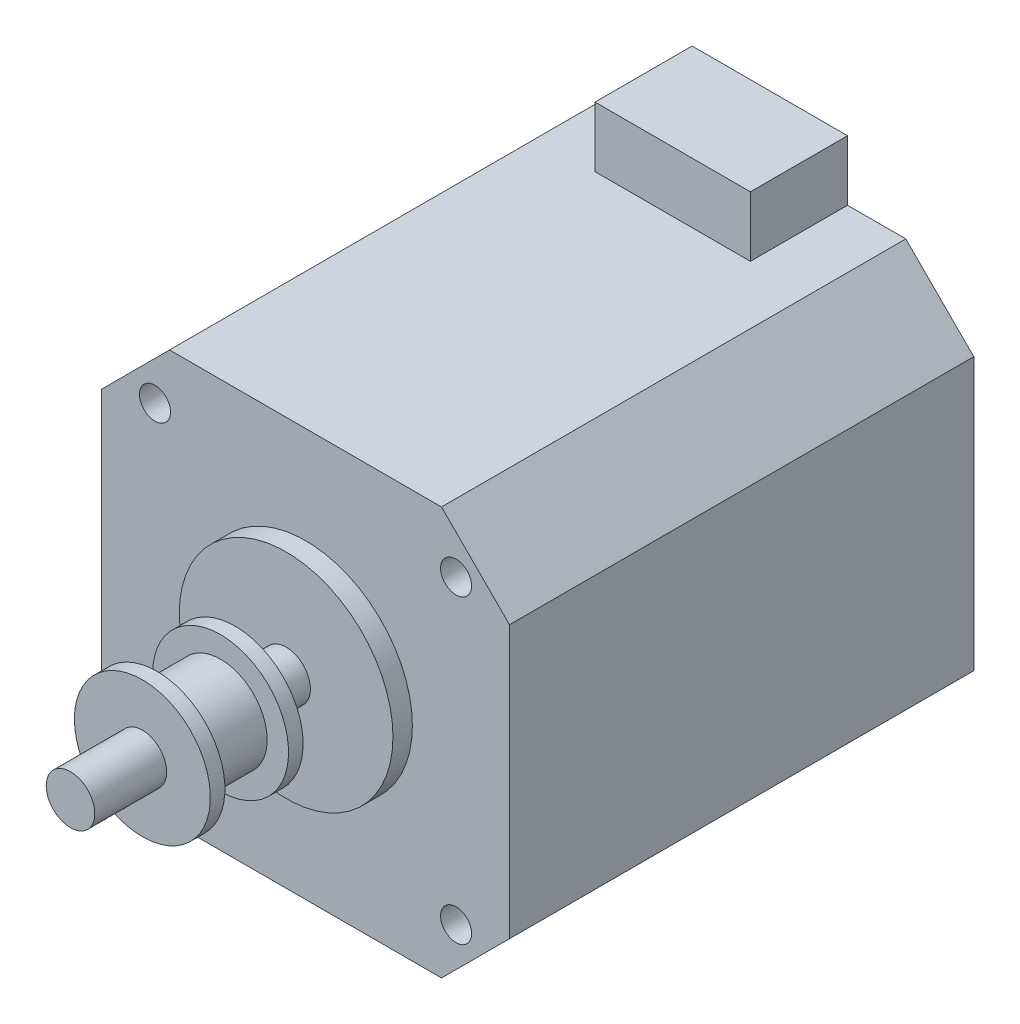
ISO-10303-21;
HEADER;
FILE_DESCRIPTION(('STEP AP214'),'2;1');
FILE_NAME('part.step','',(''),(''),'','','');
FILE_SCHEMA(('AUTOMOTIVE_DESIGN { 1 0 10303 214 1 1 1 1 }'));
ENDSEC;
DATA;
#1=APPLICATION_CONTEXT('core data for automotive mechanical design processes');
#2=APPLICATION_PROTOCOL_DEFINITION('international standard','automotive_design',2000,#1);
#3=PRODUCT_CONTEXT('',#1,'mechanical');
#4=PRODUCT('Part','Part','',(#3));
#5=PRODUCT_RELATED_PRODUCT_CATEGORY('part','',(#4));
#6=PRODUCT_DEFINITION_FORMATION('','',#4);
#7=PRODUCT_DEFINITION_CONTEXT('part definition',#1,'design');
#8=PRODUCT_DEFINITION('design','',#6,#7);
#9=PRODUCT_DEFINITION_SHAPE('','',#8);
#10=(LENGTH_UNIT() NAMED_UNIT(*) SI_UNIT(.MILLI.,.METRE.));
#11=(NAMED_UNIT(*) PLANE_ANGLE_UNIT() SI_UNIT($,.RADIAN.));
#12=(NAMED_UNIT(*) SI_UNIT($,.STERADIAN.) SOLID_ANGLE_UNIT());
#13=UNCERTAINTY_MEASURE_WITH_UNIT(LENGTH_MEASURE(1.E-05),#10,'distance_accuracy_value','');
#14=(GEOMETRIC_REPRESENTATION_CONTEXT(3) GLOBAL_UNCERTAINTY_ASSIGNED_CONTEXT((#13)) GLOBAL_UNIT_ASSIGNED_CONTEXT((#10,
#11,#12)) REPRESENTATION_CONTEXT('',''));
#15=CARTESIAN_POINT('',(0.,0.,0.));
#16=DIRECTION('',(0.,0.,1.));
#17=DIRECTION('',(1.,0.,0.));
#18=AXIS2_PLACEMENT_3D('',#15,#16,#17);
#19=CARTESIAN_POINT('',(0.,42.,47.8));
#20=DIRECTION('',(0.,-1.,0.));
#21=DIRECTION('',(0.,0.,-1.));
#22=AXIS2_PLACEMENT_3D('',#19,#20,#21);
#23=PLANE('',#22);
#24=DIRECTION('',(0.,0.,-1.));
#25=VECTOR('',#24,1.);
#26=CARTESIAN_POINT('',(29.,42.,10.));
#27=LINE('',#26,#25);
#28=CARTESIAN_POINT('',(29.,42.,10.));
#29=VERTEX_POINT('',#28);
#30=CARTESIAN_POINT('',(29.,42.,0.));
#31=VERTEX_POINT('',#30);
#32=EDGE_CURVE('E143',#29,#31,#27,.T.);
#33=ORIENTED_EDGE('',*,*,#32,.F.);
#34=DIRECTION('',(-1.,0.,0.));
#35=VECTOR('',#34,1.);
#36=CARTESIAN_POINT('',(29.,42.,10.));
#37=LINE('',#36,#35);
#38=CARTESIAN_POINT('',(13.,42.,10.));
#39=VERTEX_POINT('',#38);
#40=EDGE_CURVE('E130',#29,#39,#37,.T.);
#41=ORIENTED_EDGE('',*,*,#40,.T.);
#42=DIRECTION('',(0.,0.,-1.));
#43=VECTOR('',#42,1.);
#44=CARTESIAN_POINT('',(13.,42.,10.));
#45=LINE('',#44,#43);
#46=CARTESIAN_POINT('',(13.,42.,0.));
#47=VERTEX_POINT('',#46);
#48=EDGE_CURVE('E152',#39,#47,#45,.T.);
#49=ORIENTED_EDGE('',*,*,#48,.T.);
#50=DIRECTION('',(-1.,0.,0.));
#51=VECTOR('',#50,1.);
#52=CARTESIAN_POINT('',(0.,42.,0.));
#53=LINE('',#52,#51);
#54=CARTESIAN_POINT('',(7.00000000000002,42.,0.));
#55=VERTEX_POINT('',#54);
#56=EDGE_CURVE('E181',#47,#55,#53,.T.);
#57=ORIENTED_EDGE('',*,*,#56,.T.);
#58=DIRECTION('',(0.,0.,1.));
#59=VECTOR('',#58,1.);
#60=CARTESIAN_POINT('',(7.00000000000003,42.,47.8));
#61=LINE('',#60,#59);
#62=CARTESIAN_POINT('',(7.00000000000002,42.,47.8));
#63=VERTEX_POINT('',#62);
#64=EDGE_CURVE('E43',#55,#63,#61,.T.);
#65=ORIENTED_EDGE('',*,*,#64,.T.);
#66=DIRECTION('',(-1.,0.,0.));
#67=VECTOR('',#66,1.);
#68=CARTESIAN_POINT('',(0.,42.,47.8));
#69=LINE('',#68,#67);
#70=CARTESIAN_POINT('',(35.,42.,47.8));
#71=VERTEX_POINT('',#70);
#72=EDGE_CURVE('E169',#71,#63,#69,.T.);
#73=ORIENTED_EDGE('',*,*,#72,.F.);
#74=DIRECTION('',(0.,0.,-1.));
#75=VECTOR('',#74,1.);
#76=CARTESIAN_POINT('',(35.,42.,47.8));
#77=LINE('',#76,#75);
#78=CARTESIAN_POINT('',(35.,42.,0.));
#79=VERTEX_POINT('',#78);
#80=EDGE_CURVE('E213',#71,#79,#77,.T.);
#81=ORIENTED_EDGE('',*,*,#80,.T.);
#82=EDGE_CURVE('E151',#79,#31,#53,.T.);
#83=ORIENTED_EDGE('',*,*,#82,.T.);
#84=EDGE_LOOP('',(#33,#41,#49,#57,#65,#73,#81,#83));
#85=FACE_BOUND('',#84,.T.);
#86=ADVANCED_FACE('F38',(#85),#23,.F.);
#87=CARTESIAN_POINT('',(0.,0.,47.8));
#88=DIRECTION('',(1.,0.,0.));
#89=DIRECTION('',(0.,0.,-1.));
#90=AXIS2_PLACEMENT_3D('',#87,#88,#89);
#91=PLANE('',#90);
#92=DIRECTION('',(0.,-1.,0.));
#93=VECTOR('',#92,1.);
#94=CARTESIAN_POINT('',(0.,0.,0.));
#95=LINE('',#94,#93);
#96=CARTESIAN_POINT('',(0.,35.,0.));
#97=VERTEX_POINT('',#96);
#98=CARTESIAN_POINT('',(0.,7.00000000000001,0.));
#99=VERTEX_POINT('',#98);
#100=EDGE_CURVE('E172',#97,#99,#95,.T.);
#101=ORIENTED_EDGE('',*,*,#100,.T.);
#102=DIRECTION('',(0.,0.,1.));
#103=VECTOR('',#102,1.);
#104=CARTESIAN_POINT('',(0.,7.00000000000001,47.8));
#105=LINE('',#104,#103);
#106=CARTESIAN_POINT('',(0.,7.00000000000001,47.8));
#107=VERTEX_POINT('',#106);
#108=EDGE_CURVE('E212',#99,#107,#105,.T.);
#109=ORIENTED_EDGE('',*,*,#108,.T.);
#110=DIRECTION('',(0.,-1.,0.));
#111=VECTOR('',#110,1.);
#112=CARTESIAN_POINT('',(0.,0.,47.8));
#113=LINE('',#112,#111);
#114=CARTESIAN_POINT('',(0.,35.,47.8));
#115=VERTEX_POINT('',#114);
#116=EDGE_CURVE('E160',#115,#107,#113,.T.);
#117=ORIENTED_EDGE('',*,*,#116,.F.);
#118=DIRECTION('',(0.,0.,-1.));
#119=VECTOR('',#118,1.);
#120=CARTESIAN_POINT('',(0.,35.,47.8));
#121=LINE('',#120,#119);
#122=EDGE_CURVE('E209',#115,#97,#121,.T.);
#123=ORIENTED_EDGE('',*,*,#122,.T.);
#124=EDGE_LOOP('',(#101,#109,#117,#123));
#125=FACE_BOUND('',#124,.T.);
#126=ADVANCED_FACE('F246',(#125),#91,.F.);
#127=CARTESIAN_POINT('',(0.,0.,47.8));
#128=DIRECTION('',(0.,1.,0.));
#129=DIRECTION('',(0.,0.,1.));
#130=AXIS2_PLACEMENT_3D('',#127,#128,#129);
#131=PLANE('',#130);
#132=DIRECTION('',(1.,0.,0.));
#133=VECTOR('',#132,1.);
#134=CARTESIAN_POINT('',(0.,0.,0.));
#135=LINE('',#134,#133);
#136=CARTESIAN_POINT('',(6.99999999999999,0.,0.));
#137=VERTEX_POINT('',#136);
#138=CARTESIAN_POINT('',(35.,0.,0.));
#139=VERTEX_POINT('',#138);
#140=EDGE_CURVE('E175',#137,#139,#135,.T.);
#141=ORIENTED_EDGE('',*,*,#140,.T.);
#142=DIRECTION('',(0.,0.,1.));
#143=VECTOR('',#142,1.);
#144=CARTESIAN_POINT('',(35.,0.,47.8));
#145=LINE('',#144,#143);
#146=CARTESIAN_POINT('',(35.,0.,47.8));
#147=VERTEX_POINT('',#146);
#148=EDGE_CURVE('E199',#139,#147,#145,.T.);
#149=ORIENTED_EDGE('',*,*,#148,.T.);
#150=DIRECTION('',(1.,0.,0.));
#151=VECTOR('',#150,1.);
#152=CARTESIAN_POINT('',(0.,0.,47.8));
#153=LINE('',#152,#151);
#154=CARTESIAN_POINT('',(6.99999999999999,0.,47.8));
#155=VERTEX_POINT('',#154);
#156=EDGE_CURVE('E163',#155,#147,#153,.T.);
#157=ORIENTED_EDGE('',*,*,#156,.F.);
#158=DIRECTION('',(0.,0.,-1.));
#159=VECTOR('',#158,1.);
#160=CARTESIAN_POINT('',(6.99999999999999,0.,47.8));
#161=LINE('',#160,#159);
#162=EDGE_CURVE('E196',#155,#137,#161,.T.);
#163=ORIENTED_EDGE('',*,*,#162,.T.);
#164=EDGE_LOOP('',(#141,#149,#157,#163));
#165=FACE_BOUND('',#164,.T.);
#166=ADVANCED_FACE('F251',(#165),#131,.F.);
#167=CARTESIAN_POINT('',(42.,0.,47.8));
#168=DIRECTION('',(-1.,0.,0.));
#169=DIRECTION('',(0.,0.,1.));
#170=AXIS2_PLACEMENT_3D('',#167,#168,#169);
#171=PLANE('',#170);
#172=DIRECTION('',(0.,1.,0.));
#173=VECTOR('',#172,1.);
#174=CARTESIAN_POINT('',(42.,0.,47.8));
#175=LINE('',#174,#173);
#176=CARTESIAN_POINT('',(42.,6.99999999999999,47.8));
#177=VERTEX_POINT('',#176);
#178=CARTESIAN_POINT('',(42.,35.,47.8));
#179=VERTEX_POINT('',#178);
#180=EDGE_CURVE('E166',#177,#179,#175,.T.);
#181=ORIENTED_EDGE('',*,*,#180,.F.);
#182=DIRECTION('',(0.,0.,-1.));
#183=VECTOR('',#182,1.);
#184=CARTESIAN_POINT('',(42.,6.99999999999999,47.8));
#185=LINE('',#184,#183);
#186=CARTESIAN_POINT('',(42.,6.99999999999999,0.));
#187=VERTEX_POINT('',#186);
#188=EDGE_CURVE('E184',#177,#187,#185,.T.);
#189=ORIENTED_EDGE('',*,*,#188,.T.);
#190=DIRECTION('',(0.,1.,0.));
#191=VECTOR('',#190,1.);
#192=CARTESIAN_POINT('',(42.,0.,0.));
#193=LINE('',#192,#191);
#194=CARTESIAN_POINT('',(42.,35.,0.));
#195=VERTEX_POINT('',#194);
#196=EDGE_CURVE('E178',#187,#195,#193,.T.);
#197=ORIENTED_EDGE('',*,*,#196,.T.);
#198=DIRECTION('',(0.,0.,1.));
#199=VECTOR('',#198,1.);
#200=CARTESIAN_POINT('',(42.,35.,47.8));
#201=LINE('',#200,#199);
#202=EDGE_CURVE('E171',#195,#179,#201,.T.);
#203=ORIENTED_EDGE('',*,*,#202,.T.);
#204=EDGE_LOOP('',(#181,#189,#197,#203));
#205=FACE_BOUND('',#204,.T.);
#206=ADVANCED_FACE('F257',(#205),#171,.F.);
#207=CARTESIAN_POINT('',(0.,0.,47.8));
#208=DIRECTION('',(0.,0.,-1.));
#209=DIRECTION('',(-1.,0.,0.));
#210=AXIS2_PLACEMENT_3D('',#207,#208,#209);
#211=PLANE('',#210);
#212=CARTESIAN_POINT('',(5.50000000000001,5.50000000000001,47.8));
#213=DIRECTION('',(0.,0.,1.));
#214=DIRECTION('',(1.,0.,0.));
#215=AXIS2_PLACEMENT_3D('',#212,#213,#214);
#216=CIRCLE('',#215,1.6);
#217=CARTESIAN_POINT('',(7.10000000000001,5.50000000000001,47.8));
#218=VERTEX_POINT('',#217);
#219=EDGE_CURVE('E310',#218,#218,#216,.T.);
#220=ORIENTED_EDGE('',*,*,#219,.F.);
#221=EDGE_LOOP('',(#220));
#222=FACE_BOUND('',#221,.T.);
#223=CARTESIAN_POINT('',(36.5,5.50000000000001,47.8));
#224=DIRECTION('',(0.,0.,1.));
#225=DIRECTION('',(1.,0.,0.));
#226=AXIS2_PLACEMENT_3D('',#223,#224,#225);
#227=CIRCLE('',#226,1.6);
#228=CARTESIAN_POINT('',(38.1,5.50000000000001,47.8));
#229=VERTEX_POINT('',#228);
#230=EDGE_CURVE('E314',#229,#229,#227,.T.);
#231=ORIENTED_EDGE('',*,*,#230,.F.);
#232=EDGE_LOOP('',(#231));
#233=FACE_BOUND('',#232,.T.);
#234=CARTESIAN_POINT('',(36.5,36.5,47.8));
#235=DIRECTION('',(0.,0.,1.));
#236=DIRECTION('',(1.,0.,0.));
#237=AXIS2_PLACEMENT_3D('',#234,#235,#236);
#238=CIRCLE('',#237,1.6);
#239=CARTESIAN_POINT('',(38.1,36.5,47.8));
#240=VERTEX_POINT('',#239);
#241=EDGE_CURVE('E318',#240,#240,#238,.T.);
#242=ORIENTED_EDGE('',*,*,#241,.F.);
#243=EDGE_LOOP('',(#242));
#244=FACE_BOUND('',#243,.T.);
#245=CARTESIAN_POINT('',(5.50000000000001,36.5,47.8));
#246=DIRECTION('',(0.,0.,1.));
#247=DIRECTION('',(1.,0.,0.));
#248=AXIS2_PLACEMENT_3D('',#245,#246,#247);
#249=CIRCLE('',#248,1.6);
#250=CARTESIAN_POINT('',(7.10000000000001,36.5,47.8));
#251=VERTEX_POINT('',#250);
#252=EDGE_CURVE('E322',#251,#251,#249,.T.);
#253=ORIENTED_EDGE('',*,*,#252,.F.);
#254=EDGE_LOOP('',(#253));
#255=FACE_BOUND('',#254,.T.);
#256=CARTESIAN_POINT('',(21.,21.,47.8));
#257=DIRECTION('',(0.,0.,1.));
#258=DIRECTION('',(1.,0.,0.));
#259=AXIS2_PLACEMENT_3D('',#256,#257,#258);
#260=CIRCLE('',#259,11.);
#261=CARTESIAN_POINT('',(32.,21.,47.8));
#262=VERTEX_POINT('',#261);
#263=EDGE_CURVE('E11',#262,#262,#260,.T.);
#264=ORIENTED_EDGE('',*,*,#263,.F.);
#265=EDGE_LOOP('',(#264));
#266=FACE_BOUND('',#265,.T.);
#267=ORIENTED_EDGE('',*,*,#156,.T.);
#268=DIRECTION('',(-0.707106781186549,-0.707106781186546,0.));
#269=VECTOR('',#268,1.);
#270=CARTESIAN_POINT('',(42.,6.99999999999999,47.8));
#271=LINE('',#270,#269);
#272=EDGE_CURVE('E207',#147,#177,#271,.F.);
#273=ORIENTED_EDGE('',*,*,#272,.T.);
#274=ORIENTED_EDGE('',*,*,#180,.T.);
#275=DIRECTION('',(0.707106781186546,-0.707106781186549,0.));
#276=VECTOR('',#275,1.);
#277=CARTESIAN_POINT('',(35.,42.,47.8));
#278=LINE('',#277,#276);
#279=EDGE_CURVE('E201',#179,#71,#278,.F.);
#280=ORIENTED_EDGE('',*,*,#279,.T.);
#281=ORIENTED_EDGE('',*,*,#72,.T.);
#282=DIRECTION('',(0.707106781186549,0.707106781186546,0.));
#283=VECTOR('',#282,1.);
#284=CARTESIAN_POINT('',(0.,35.,47.8));
#285=LINE('',#284,#283);
#286=EDGE_CURVE('E203',#63,#115,#285,.F.);
#287=ORIENTED_EDGE('',*,*,#286,.T.);
#288=ORIENTED_EDGE('',*,*,#116,.T.);
#289=DIRECTION('',(-0.707106781186546,0.707106781186549,0.));
#290=VECTOR('',#289,1.);
#291=CARTESIAN_POINT('',(6.99999999999999,0.,47.8));
#292=LINE('',#291,#290);
#293=EDGE_CURVE('E205',#107,#155,#292,.F.);
#294=ORIENTED_EDGE('',*,*,#293,.T.);
#295=EDGE_LOOP('',(#267,#273,#274,#280,#281,#287,#288,#294));
#296=FACE_BOUND('',#295,.T.);
#297=ADVANCED_FACE('F260',(#222,#233,#244,#255,#266,#296),#211,.F.);
#298=CARTESIAN_POINT('',(0.,0.,0.));
#299=DIRECTION('',(0.,0.,-1.));
#300=DIRECTION('',(-1.,0.,0.));
#301=AXIS2_PLACEMENT_3D('',#298,#299,#300);
#302=PLANE('',#301);
#303=ORIENTED_EDGE('',*,*,#196,.F.);
#304=DIRECTION('',(0.707106781186549,0.707106781186546,0.));
#305=VECTOR('',#304,1.);
#306=CARTESIAN_POINT('',(17.4999999999999,-17.5,0.));
#307=LINE('',#306,#305);
#308=EDGE_CURVE('E194',#187,#139,#307,.F.);
#309=ORIENTED_EDGE('',*,*,#308,.T.);
#310=ORIENTED_EDGE('',*,*,#140,.F.);
#311=DIRECTION('',(0.707106781186546,-0.707106781186549,0.));
#312=VECTOR('',#311,1.);
#313=CARTESIAN_POINT('',(3.50000000000001,3.5,0.));
#314=LINE('',#313,#312);
#315=EDGE_CURVE('E192',#137,#99,#314,.F.);
#316=ORIENTED_EDGE('',*,*,#315,.T.);
#317=ORIENTED_EDGE('',*,*,#100,.F.);
#318=DIRECTION('',(-0.707106781186549,-0.707106781186546,0.));
#319=VECTOR('',#318,1.);
#320=CARTESIAN_POINT('',(-17.5,17.5000000000001,0.));
#321=LINE('',#320,#319);
#322=EDGE_CURVE('E189',#97,#55,#321,.F.);
#323=ORIENTED_EDGE('',*,*,#322,.T.);
#324=ORIENTED_EDGE('',*,*,#56,.F.);
#325=DIRECTION('',(0.,1.,0.));
#326=VECTOR('',#325,1.);
#327=CARTESIAN_POINT('',(13.,42.,0.));
#328=LINE('',#327,#326);
#329=CARTESIAN_POINT('',(13.,48.2,0.));
#330=VERTEX_POINT('',#329);
#331=EDGE_CURVE('E55',#47,#330,#328,.T.);
#332=ORIENTED_EDGE('',*,*,#331,.T.);
#333=DIRECTION('',(1.,0.,0.));
#334=VECTOR('',#333,1.);
#335=CARTESIAN_POINT('',(29.,48.2,0.));
#336=LINE('',#335,#334);
#337=CARTESIAN_POINT('',(29.,48.2,0.));
#338=VERTEX_POINT('',#337);
#339=EDGE_CURVE('E146',#330,#338,#336,.T.);
#340=ORIENTED_EDGE('',*,*,#339,.T.);
#341=DIRECTION('',(0.,-1.,0.));
#342=VECTOR('',#341,1.);
#343=CARTESIAN_POINT('',(29.,42.,0.));
#344=LINE('',#343,#342);
#345=EDGE_CURVE('E221',#338,#31,#344,.T.);
#346=ORIENTED_EDGE('',*,*,#345,.T.);
#347=ORIENTED_EDGE('',*,*,#82,.F.);
#348=DIRECTION('',(-0.707106781186546,0.707106781186549,0.));
#349=VECTOR('',#348,1.);
#350=CARTESIAN_POINT('',(38.5000000000001,38.4999999999999,0.));
#351=LINE('',#350,#349);
#352=EDGE_CURVE('E187',#79,#195,#351,.F.);
#353=ORIENTED_EDGE('',*,*,#352,.T.);
#354=EDGE_LOOP('',(#303,#309,#310,#316,#317,#323,#324,#332,#340,#346,#347,#353));
#355=FACE_BOUND('',#354,.T.);
#356=ADVANCED_FACE('F219',(#355),#302,.T.);
#357=CARTESIAN_POINT('',(42.,6.99999999999999,47.8));
#358=DIRECTION('',(-0.707106781186546,0.707106781186549,0.));
#359=DIRECTION('',(0.,0.,-1.));
#360=AXIS2_PLACEMENT_3D('',#357,#358,#359);
#361=PLANE('',#360);
#362=ORIENTED_EDGE('',*,*,#272,.F.);
#363=ORIENTED_EDGE('',*,*,#148,.F.);
#364=ORIENTED_EDGE('',*,*,#308,.F.);
#365=ORIENTED_EDGE('',*,*,#188,.F.);
#366=EDGE_LOOP('',(#362,#363,#364,#365));
#367=FACE_BOUND('',#366,.T.);
#368=ADVANCED_FACE('F266',(#367),#361,.F.);
#369=CARTESIAN_POINT('',(6.99999999999999,0.,47.8));
#370=DIRECTION('',(0.707106781186549,0.707106781186546,0.));
#371=DIRECTION('',(0.,0.,-1.));
#372=AXIS2_PLACEMENT_3D('',#369,#370,#371);
#373=PLANE('',#372);
#374=ORIENTED_EDGE('',*,*,#293,.F.);
#375=ORIENTED_EDGE('',*,*,#108,.F.);
#376=ORIENTED_EDGE('',*,*,#315,.F.);
#377=ORIENTED_EDGE('',*,*,#162,.F.);
#378=EDGE_LOOP('',(#374,#375,#376,#377));
#379=FACE_BOUND('',#378,.T.);
#380=ADVANCED_FACE('F272',(#379),#373,.F.);
#381=CARTESIAN_POINT('',(0.,35.,47.8));
#382=DIRECTION('',(0.707106781186546,-0.707106781186549,0.));
#383=DIRECTION('',(0.,0.,-1.));
#384=AXIS2_PLACEMENT_3D('',#381,#382,#383);
#385=PLANE('',#384);
#386=ORIENTED_EDGE('',*,*,#286,.F.);
#387=ORIENTED_EDGE('',*,*,#64,.F.);
#388=ORIENTED_EDGE('',*,*,#322,.F.);
#389=ORIENTED_EDGE('',*,*,#122,.F.);
#390=EDGE_LOOP('',(#386,#387,#388,#389));
#391=FACE_BOUND('',#390,.T.);
#392=ADVANCED_FACE('F278',(#391),#385,.F.);
#393=CARTESIAN_POINT('',(35.,42.,47.8));
#394=DIRECTION('',(-0.707106781186549,-0.707106781186546,0.));
#395=DIRECTION('',(0.,0.,-1.));
#396=AXIS2_PLACEMENT_3D('',#393,#394,#395);
#397=PLANE('',#396);
#398=ORIENTED_EDGE('',*,*,#279,.F.);
#399=ORIENTED_EDGE('',*,*,#202,.F.);
#400=ORIENTED_EDGE('',*,*,#352,.F.);
#401=ORIENTED_EDGE('',*,*,#80,.F.);
#402=EDGE_LOOP('',(#398,#399,#400,#401));
#403=FACE_BOUND('',#402,.T.);
#404=ADVANCED_FACE('F41',(#403),#397,.F.);
#405=CARTESIAN_POINT('',(29.,42.,10.));
#406=DIRECTION('',(1.,0.,0.));
#407=DIRECTION('',(0.,0.,-1.));
#408=AXIS2_PLACEMENT_3D('',#405,#406,#407);
#409=PLANE('',#408);
#410=ORIENTED_EDGE('',*,*,#345,.F.);
#411=DIRECTION('',(0.,0.,-1.));
#412=VECTOR('',#411,1.);
#413=CARTESIAN_POINT('',(29.,48.2,10.));
#414=LINE('',#413,#412);
#415=CARTESIAN_POINT('',(29.,48.2,10.));
#416=VERTEX_POINT('',#415);
#417=EDGE_CURVE('E145',#416,#338,#414,.T.);
#418=ORIENTED_EDGE('',*,*,#417,.F.);
#419=DIRECTION('',(0.,-1.,0.));
#420=VECTOR('',#419,1.);
#421=CARTESIAN_POINT('',(29.,42.,10.));
#422=LINE('',#421,#420);
#423=EDGE_CURVE('E134',#416,#29,#422,.T.);
#424=ORIENTED_EDGE('',*,*,#423,.T.);
#425=ORIENTED_EDGE('',*,*,#32,.T.);
#426=EDGE_LOOP('',(#410,#418,#424,#425));
#427=FACE_BOUND('',#426,.T.);
#428=ADVANCED_FACE('F142',(#427),#409,.T.);
#429=CARTESIAN_POINT('',(29.,48.2,10.));
#430=DIRECTION('',(0.,1.,0.));
#431=DIRECTION('',(0.,0.,1.));
#432=AXIS2_PLACEMENT_3D('',#429,#430,#431);
#433=PLANE('',#432);
#434=ORIENTED_EDGE('',*,*,#339,.F.);
#435=DIRECTION('',(0.,0.,-1.));
#436=VECTOR('',#435,1.);
#437=CARTESIAN_POINT('',(13.,48.2,10.));
#438=LINE('',#437,#436);
#439=CARTESIAN_POINT('',(13.,48.2,10.));
#440=VERTEX_POINT('',#439);
#441=EDGE_CURVE('E155',#440,#330,#438,.T.);
#442=ORIENTED_EDGE('',*,*,#441,.F.);
#443=DIRECTION('',(1.,0.,0.));
#444=VECTOR('',#443,1.);
#445=CARTESIAN_POINT('',(29.,48.2,10.));
#446=LINE('',#445,#444);
#447=EDGE_CURVE('E153',#440,#416,#446,.T.);
#448=ORIENTED_EDGE('',*,*,#447,.T.);
#449=ORIENTED_EDGE('',*,*,#417,.T.);
#450=EDGE_LOOP('',(#434,#442,#448,#449));
#451=FACE_BOUND('',#450,.T.);
#452=ADVANCED_FACE('F235',(#451),#433,.T.);
#453=CARTESIAN_POINT('',(13.,42.,10.));
#454=DIRECTION('',(-1.,0.,0.));
#455=DIRECTION('',(0.,0.,1.));
#456=AXIS2_PLACEMENT_3D('',#453,#454,#455);
#457=PLANE('',#456);
#458=ORIENTED_EDGE('',*,*,#331,.F.);
#459=ORIENTED_EDGE('',*,*,#48,.F.);
#460=DIRECTION('',(0.,1.,0.));
#461=VECTOR('',#460,1.);
#462=CARTESIAN_POINT('',(13.,42.,10.));
#463=LINE('',#462,#461);
#464=EDGE_CURVE('E137',#39,#440,#463,.T.);
#465=ORIENTED_EDGE('',*,*,#464,.T.);
#466=ORIENTED_EDGE('',*,*,#441,.T.);
#467=EDGE_LOOP('',(#458,#459,#465,#466));
#468=FACE_BOUND('',#467,.T.);
#469=ADVANCED_FACE('F232',(#468),#457,.T.);
#470=CARTESIAN_POINT('',(0.,0.,10.));
#471=DIRECTION('',(0.,0.,1.));
#472=DIRECTION('',(1.,0.,0.));
#473=AXIS2_PLACEMENT_3D('',#470,#471,#472);
#474=PLANE('',#473);
#475=ORIENTED_EDGE('',*,*,#423,.F.);
#476=ORIENTED_EDGE('',*,*,#447,.F.);
#477=ORIENTED_EDGE('',*,*,#464,.F.);
#478=ORIENTED_EDGE('',*,*,#40,.F.);
#479=EDGE_LOOP('',(#475,#476,#477,#478));
#480=FACE_BOUND('',#479,.T.);
#481=ADVANCED_FACE('F132',(#480),#474,.T.);
#482=CARTESIAN_POINT('',(21.,21.,49.8));
#483=DIRECTION('',(0.,0.,-1.));
#484=DIRECTION('',(-1.,0.,0.));
#485=AXIS2_PLACEMENT_3D('',#482,#483,#484);
#486=CYLINDRICAL_SURFACE('',#485,11.);
#487=CARTESIAN_POINT('',(21.,21.,49.8));
#488=DIRECTION('',(0.,0.,1.));
#489=DIRECTION('',(1.,0.,0.));
#490=AXIS2_PLACEMENT_3D('',#487,#488,#489);
#491=CIRCLE('',#490,11.);
#492=CARTESIAN_POINT('',(32.,21.,49.8));
#493=VERTEX_POINT('',#492);
#494=EDGE_CURVE('E223',#493,#493,#491,.T.);
#495=ORIENTED_EDGE('',*,*,#494,.F.);
#496=EDGE_LOOP('',(#495));
#497=FACE_BOUND('',#496,.T.);
#498=ORIENTED_EDGE('',*,*,#263,.T.);
#499=EDGE_LOOP('',(#498));
#500=FACE_BOUND('',#499,.T.);
#501=ADVANCED_FACE('F325',(#497,#500),#486,.T.);
#502=CARTESIAN_POINT('',(21.,21.,49.8));
#503=DIRECTION('',(0.,0.,1.));
#504=DIRECTION('',(1.,0.,0.));
#505=AXIS2_PLACEMENT_3D('',#502,#503,#504);
#506=PLANE('',#505);
#507=CARTESIAN_POINT('',(21.,21.,49.8));
#508=DIRECTION('',(0.,0.,-1.));
#509=DIRECTION('',(-1.,0.,0.));
#510=AXIS2_PLACEMENT_3D('',#507,#508,#509);
#511=CIRCLE('',#510,2.5);
#512=CARTESIAN_POINT('',(18.5,21.,49.8));
#513=VERTEX_POINT('',#512);
#514=EDGE_CURVE('E420',#513,#513,#511,.T.);
#515=ORIENTED_EDGE('',*,*,#514,.T.);
#516=EDGE_LOOP('',(#515));
#517=FACE_BOUND('',#516,.T.);
#518=ORIENTED_EDGE('',*,*,#494,.T.);
#519=EDGE_LOOP('',(#518));
#520=FACE_BOUND('',#519,.T.);
#521=ADVANCED_FACE('F327',(#517,#520),#506,.T.);
#522=CARTESIAN_POINT('',(5.50000000000001,36.5,44.8));
#523=DIRECTION('',(0.,0.,1.));
#524=DIRECTION('',(1.,0.,0.));
#525=AXIS2_PLACEMENT_3D('',#522,#523,#524);
#526=CYLINDRICAL_SURFACE('',#525,1.6);
#527=CARTESIAN_POINT('',(5.50000000000001,36.5,44.8));
#528=DIRECTION('',(0.,0.,1.));
#529=DIRECTION('',(1.,0.,0.));
#530=AXIS2_PLACEMENT_3D('',#527,#528,#529);
#531=CIRCLE('',#530,1.6);
#532=CARTESIAN_POINT('',(7.10000000000001,36.5,44.8));
#533=VERTEX_POINT('',#532);
#534=EDGE_CURVE('E227',#533,#533,#531,.T.);
#535=ORIENTED_EDGE('',*,*,#534,.F.);
#536=EDGE_LOOP('',(#535));
#537=FACE_BOUND('',#536,.T.);
#538=ORIENTED_EDGE('',*,*,#252,.T.);
#539=EDGE_LOOP('',(#538));
#540=FACE_BOUND('',#539,.T.);
#541=ADVANCED_FACE('F334',(#537,#540),#526,.F.);
#542=CARTESIAN_POINT('',(5.50000000000001,36.5,44.8));
#543=DIRECTION('',(0.,0.,1.));
#544=DIRECTION('',(1.,0.,0.));
#545=AXIS2_PLACEMENT_3D('',#542,#543,#544);
#546=PLANE('',#545);
#547=ORIENTED_EDGE('',*,*,#534,.T.);
#548=EDGE_LOOP('',(#547));
#549=FACE_BOUND('',#548,.T.);
#550=ADVANCED_FACE('F341',(#549),#546,.T.);
#551=CARTESIAN_POINT('',(36.5,36.5,44.8));
#552=DIRECTION('',(0.,0.,1.));
#553=DIRECTION('',(1.,0.,0.));
#554=AXIS2_PLACEMENT_3D('',#551,#552,#553);
#555=CYLINDRICAL_SURFACE('',#554,1.6);
#556=CARTESIAN_POINT('',(36.5,36.5,44.8));
#557=DIRECTION('',(0.,0.,1.));
#558=DIRECTION('',(1.,0.,0.));
#559=AXIS2_PLACEMENT_3D('',#556,#557,#558);
#560=CIRCLE('',#559,1.6);
#561=CARTESIAN_POINT('',(38.1,36.5,44.8));
#562=VERTEX_POINT('',#561);
#563=EDGE_CURVE('E442',#562,#562,#560,.T.);
#564=ORIENTED_EDGE('',*,*,#563,.F.);
#565=EDGE_LOOP('',(#564));
#566=FACE_BOUND('',#565,.T.);
#567=ORIENTED_EDGE('',*,*,#241,.T.);
#568=EDGE_LOOP('',(#567));
#569=FACE_BOUND('',#568,.T.);
#570=ADVANCED_FACE('F345',(#566,#569),#555,.F.);
#571=CARTESIAN_POINT('',(36.5,36.5,44.8));
#572=DIRECTION('',(0.,0.,1.));
#573=DIRECTION('',(1.,0.,0.));
#574=AXIS2_PLACEMENT_3D('',#571,#572,#573);
#575=PLANE('',#574);
#576=ORIENTED_EDGE('',*,*,#563,.T.);
#577=EDGE_LOOP('',(#576));
#578=FACE_BOUND('',#577,.T.);
#579=ADVANCED_FACE('F360',(#578),#575,.T.);
#580=CARTESIAN_POINT('',(36.5,5.50000000000001,44.8));
#581=DIRECTION('',(0.,0.,1.));
#582=DIRECTION('',(1.,0.,0.));
#583=AXIS2_PLACEMENT_3D('',#580,#581,#582);
#584=CYLINDRICAL_SURFACE('',#583,1.6);
#585=CARTESIAN_POINT('',(36.5,5.50000000000001,44.8));
#586=DIRECTION('',(0.,0.,1.));
#587=DIRECTION('',(1.,0.,0.));
#588=AXIS2_PLACEMENT_3D('',#585,#586,#587);
#589=CIRCLE('',#588,1.6);
#590=CARTESIAN_POINT('',(38.1,5.50000000000001,44.8));
#591=VERTEX_POINT('',#590);
#592=EDGE_CURVE('E446',#591,#591,#589,.T.);
#593=ORIENTED_EDGE('',*,*,#592,.F.);
#594=EDGE_LOOP('',(#593));
#595=FACE_BOUND('',#594,.T.);
#596=ORIENTED_EDGE('',*,*,#230,.T.);
#597=EDGE_LOOP('',(#596));
#598=FACE_BOUND('',#597,.T.);
#599=ADVANCED_FACE('F357',(#595,#598),#584,.F.);
#600=CARTESIAN_POINT('',(36.5,5.50000000000001,44.8));
#601=DIRECTION('',(0.,0.,1.));
#602=DIRECTION('',(1.,0.,0.));
#603=AXIS2_PLACEMENT_3D('',#600,#601,#602);
#604=PLANE('',#603);
#605=ORIENTED_EDGE('',*,*,#592,.T.);
#606=EDGE_LOOP('',(#605));
#607=FACE_BOUND('',#606,.T.);
#608=ADVANCED_FACE('F351',(#607),#604,.T.);
#609=CARTESIAN_POINT('',(5.50000000000001,5.50000000000001,44.8));
#610=DIRECTION('',(0.,0.,1.));
#611=DIRECTION('',(1.,0.,0.));
#612=AXIS2_PLACEMENT_3D('',#609,#610,#611);
#613=CYLINDRICAL_SURFACE('',#612,1.6);
#614=CARTESIAN_POINT('',(5.50000000000001,5.50000000000001,44.8));
#615=DIRECTION('',(0.,0.,1.));
#616=DIRECTION('',(1.,0.,0.));
#617=AXIS2_PLACEMENT_3D('',#614,#615,#616);
#618=CIRCLE('',#617,1.6);
#619=CARTESIAN_POINT('',(7.10000000000001,5.50000000000001,44.8));
#620=VERTEX_POINT('',#619);
#621=EDGE_CURVE('E450',#620,#620,#618,.T.);
#622=ORIENTED_EDGE('',*,*,#621,.F.);
#623=EDGE_LOOP('',(#622));
#624=FACE_BOUND('',#623,.T.);
#625=ORIENTED_EDGE('',*,*,#219,.T.);
#626=EDGE_LOOP('',(#625));
#627=FACE_BOUND('',#626,.T.);
#628=ADVANCED_FACE('F347',(#624,#627),#613,.F.);
#629=CARTESIAN_POINT('',(5.50000000000001,5.50000000000001,44.8));
#630=DIRECTION('',(0.,0.,1.));
#631=DIRECTION('',(1.,0.,0.));
#632=AXIS2_PLACEMENT_3D('',#629,#630,#631);
#633=PLANE('',#632);
#634=ORIENTED_EDGE('',*,*,#621,.T.);
#635=EDGE_LOOP('',(#634));
#636=FACE_BOUND('',#635,.T.);
#637=ADVANCED_FACE('F350',(#636),#633,.T.);
#638=CARTESIAN_POINT('',(21.,21.,49.8));
#639=DIRECTION('',(0.,0.,-1.));
#640=DIRECTION('',(-1.,0.,0.));
#641=AXIS2_PLACEMENT_3D('',#638,#639,#640);
#642=CYLINDRICAL_SURFACE('',#641,4.8);
#643=CARTESIAN_POINT('',(21.,21.,56.55));
#644=DIRECTION('',(0.,0.,-1.));
#645=DIRECTION('',(-1.,0.,0.));
#646=AXIS2_PLACEMENT_3D('',#643,#644,#645);
#647=CIRCLE('',#646,4.8);
#648=CARTESIAN_POINT('',(16.2,21.,56.55));
#649=VERTEX_POINT('',#648);
#650=EDGE_CURVE('E415',#649,#649,#647,.T.);
#651=ORIENTED_EDGE('',*,*,#650,.F.);
#652=EDGE_LOOP('',(#651));
#653=FACE_BOUND('',#652,.T.);
#654=CARTESIAN_POINT('',(21.,21.,63.1));
#655=DIRECTION('',(0.,0.,-1.));
#656=DIRECTION('',(-1.,0.,0.));
#657=AXIS2_PLACEMENT_3D('',#654,#655,#656);
#658=CIRCLE('',#657,4.8);
#659=CARTESIAN_POINT('',(16.2,21.,63.1));
#660=VERTEX_POINT('',#659);
#661=EDGE_CURVE('E418',#660,#660,#658,.T.);
#662=ORIENTED_EDGE('',*,*,#661,.T.);
#663=EDGE_LOOP('',(#662));
#664=FACE_BOUND('',#663,.T.);
#665=ADVANCED_FACE('F355',(#653,#664),#642,.T.);
#666=CARTESIAN_POINT('',(0.,21.,63.1));
#667=DIRECTION('',(0.,0.,1.));
#668=DIRECTION('',(1.,0.,0.));
#669=AXIS2_PLACEMENT_3D('',#666,#667,#668);
#670=PLANE('',#669);
#671=ORIENTED_EDGE('',*,*,#661,.F.);
#672=EDGE_LOOP('',(#671));
#673=FACE_BOUND('',#672,.T.);
#674=CARTESIAN_POINT('',(21.,21.,63.1));
#675=DIRECTION('',(0.,0.,-1.));
#676=DIRECTION('',(-1.,0.,0.));
#677=AXIS2_PLACEMENT_3D('',#674,#675,#676);
#678=CIRCLE('',#677,7.);
#679=CARTESIAN_POINT('',(14.,21.,63.1));
#680=VERTEX_POINT('',#679);
#681=EDGE_CURVE('E425',#680,#680,#678,.T.);
#682=ORIENTED_EDGE('',*,*,#681,.T.);
#683=EDGE_LOOP('',(#682));
#684=FACE_BOUND('',#683,.T.);
#685=ADVANCED_FACE('F393',(#673,#684),#670,.F.);
#686=CARTESIAN_POINT('',(21.,21.,49.8));
#687=DIRECTION('',(0.,0.,-1.));
#688=DIRECTION('',(-1.,0.,0.));
#689=AXIS2_PLACEMENT_3D('',#686,#687,#688);
#690=CYLINDRICAL_SURFACE('',#689,7.);
#691=ORIENTED_EDGE('',*,*,#681,.F.);
#692=EDGE_LOOP('',(#691));
#693=FACE_BOUND('',#692,.T.);
#694=CARTESIAN_POINT('',(21.,21.,64.6));
#695=DIRECTION('',(0.,0.,-1.));
#696=DIRECTION('',(-1.,0.,0.));
#697=AXIS2_PLACEMENT_3D('',#694,#695,#696);
#698=CIRCLE('',#697,7.);
#699=CARTESIAN_POINT('',(14.,21.,64.6));
#700=VERTEX_POINT('',#699);
#701=EDGE_CURVE('E428',#700,#700,#698,.T.);
#702=ORIENTED_EDGE('',*,*,#701,.T.);
#703=EDGE_LOOP('',(#702));
#704=FACE_BOUND('',#703,.T.);
#705=ADVANCED_FACE('F389',(#693,#704),#690,.T.);
#706=CARTESIAN_POINT('',(0.,21.,64.6));
#707=DIRECTION('',(0.,0.,-1.));
#708=DIRECTION('',(-1.,0.,0.));
#709=AXIS2_PLACEMENT_3D('',#706,#707,#708);
#710=PLANE('',#709);
#711=ORIENTED_EDGE('',*,*,#701,.F.);
#712=EDGE_LOOP('',(#711));
#713=FACE_BOUND('',#712,.T.);
#714=CARTESIAN_POINT('',(21.,21.,64.6));
#715=DIRECTION('',(0.,0.,-1.));
#716=DIRECTION('',(-1.,0.,0.));
#717=AXIS2_PLACEMENT_3D('',#714,#715,#716);
#718=CIRCLE('',#717,2.5);
#719=CARTESIAN_POINT('',(18.5,21.,64.6));
#720=VERTEX_POINT('',#719);
#721=EDGE_CURVE('E431',#720,#720,#718,.T.);
#722=ORIENTED_EDGE('',*,*,#721,.T.);
#723=EDGE_LOOP('',(#722));
#724=FACE_BOUND('',#723,.T.);
#725=ADVANCED_FACE('F385',(#713,#724),#710,.F.);
#726=CARTESIAN_POINT('',(0.,21.,56.55));
#727=DIRECTION('',(0.,0.,-1.));
#728=DIRECTION('',(-1.,0.,0.));
#729=AXIS2_PLACEMENT_3D('',#726,#727,#728);
#730=PLANE('',#729);
#731=CARTESIAN_POINT('',(21.,21.,56.55));
#732=DIRECTION('',(0.,0.,-1.));
#733=DIRECTION('',(-1.,0.,0.));
#734=AXIS2_PLACEMENT_3D('',#731,#732,#733);
#735=CIRCLE('',#734,7.00000000000001);
#736=CARTESIAN_POINT('',(14.,21.,56.55));
#737=VERTEX_POINT('',#736);
#738=EDGE_CURVE('E414',#737,#737,#735,.T.);
#739=ORIENTED_EDGE('',*,*,#738,.F.);
#740=EDGE_LOOP('',(#739));
#741=FACE_BOUND('',#740,.T.);
#742=ORIENTED_EDGE('',*,*,#650,.T.);
#743=EDGE_LOOP('',(#742));
#744=FACE_BOUND('',#743,.T.);
#745=ADVANCED_FACE('F388',(#741,#744),#730,.F.);
#746=CARTESIAN_POINT('',(21.,21.,49.8));
#747=DIRECTION('',(0.,0.,-1.));
#748=DIRECTION('',(-1.,0.,0.));
#749=AXIS2_PLACEMENT_3D('',#746,#747,#748);
#750=CYLINDRICAL_SURFACE('',#749,7.00000000000001);
#751=CARTESIAN_POINT('',(21.,21.,55.05));
#752=DIRECTION('',(0.,0.,-1.));
#753=DIRECTION('',(-1.,0.,0.));
#754=AXIS2_PLACEMENT_3D('',#751,#752,#753);
#755=CIRCLE('',#754,7.00000000000001);
#756=CARTESIAN_POINT('',(14.,21.,55.05));
#757=VERTEX_POINT('',#756);
#758=EDGE_CURVE('E411',#757,#757,#755,.T.);
#759=ORIENTED_EDGE('',*,*,#758,.F.);
#760=EDGE_LOOP('',(#759));
#761=FACE_BOUND('',#760,.T.);
#762=ORIENTED_EDGE('',*,*,#738,.T.);
#763=EDGE_LOOP('',(#762));
#764=FACE_BOUND('',#763,.T.);
#765=ADVANCED_FACE('F383',(#761,#764),#750,.T.);
#766=CARTESIAN_POINT('',(0.,21.,55.05));
#767=DIRECTION('',(0.,0.,1.));
#768=DIRECTION('',(1.,0.,0.));
#769=AXIS2_PLACEMENT_3D('',#766,#767,#768);
#770=PLANE('',#769);
#771=CARTESIAN_POINT('',(21.,21.,55.05));
#772=DIRECTION('',(0.,0.,-1.));
#773=DIRECTION('',(-1.,0.,0.));
#774=AXIS2_PLACEMENT_3D('',#771,#772,#773);
#775=CIRCLE('',#774,2.5);
#776=CARTESIAN_POINT('',(18.5,21.,55.05));
#777=VERTEX_POINT('',#776);
#778=EDGE_CURVE('E434',#777,#777,#775,.T.);
#779=ORIENTED_EDGE('',*,*,#778,.F.);
#780=EDGE_LOOP('',(#779));
#781=FACE_BOUND('',#780,.T.);
#782=ORIENTED_EDGE('',*,*,#758,.T.);
#783=EDGE_LOOP('',(#782));
#784=FACE_BOUND('',#783,.T.);
#785=ADVANCED_FACE('F379',(#781,#784),#770,.F.);
#786=CARTESIAN_POINT('',(23.5,21.,72.));
#787=DIRECTION('',(0.,0.,1.));
#788=DIRECTION('',(1.,0.,0.));
#789=AXIS2_PLACEMENT_3D('',#786,#787,#788);
#790=PLANE('',#789);
#791=CARTESIAN_POINT('',(21.,21.,72.));
#792=DIRECTION('',(0.,0.,-1.));
#793=DIRECTION('',(-1.,0.,0.));
#794=AXIS2_PLACEMENT_3D('',#791,#792,#793);
#795=CIRCLE('',#794,2.5);
#796=CARTESIAN_POINT('',(18.5,21.,72.));
#797=VERTEX_POINT('',#796);
#798=EDGE_CURVE('E437',#797,#797,#795,.T.);
#799=ORIENTED_EDGE('',*,*,#798,.F.);
#800=EDGE_LOOP('',(#799));
#801=FACE_BOUND('',#800,.T.);
#802=ADVANCED_FACE('F376',(#801),#790,.T.);
#803=CARTESIAN_POINT('',(21.,21.,49.8));
#804=DIRECTION('',(0.,0.,-1.));
#805=DIRECTION('',(-1.,0.,0.));
#806=AXIS2_PLACEMENT_3D('',#803,#804,#805);
#807=CYLINDRICAL_SURFACE('',#806,2.5);
#808=ORIENTED_EDGE('',*,*,#798,.T.);
#809=EDGE_LOOP('',(#808));
#810=FACE_BOUND('',#809,.T.);
#811=ORIENTED_EDGE('',*,*,#721,.F.);
#812=EDGE_LOOP('',(#811));
#813=FACE_BOUND('',#812,.T.);
#814=ADVANCED_FACE('F374',(#810,#813),#807,.T.);
#815=ORIENTED_EDGE('',*,*,#514,.F.);
#816=EDGE_LOOP('',(#815));
#817=FACE_BOUND('',#816,.T.);
#818=ORIENTED_EDGE('',*,*,#778,.T.);
#819=EDGE_LOOP('',(#818));
#820=FACE_BOUND('',#819,.T.);
#821=ADVANCED_FACE('F371',(#817,#820),#807,.T.);
#822=CLOSED_SHELL('',(#86,#126,#166,#206,#297,#356,#368,#380,#392,#404,#428,#452,#469,#481,#501,
#521,#541,#550,#570,#579,#599,#608,#628,#637,#665,#685,#705,#725,#745,#765,#785,#802,#814,#821));
#823=MANIFOLD_SOLID_BREP('B2',#822);
#824=ADVANCED_BREP_SHAPE_REPRESENTATION('',(#18,#823),#14);
#825=SHAPE_DEFINITION_REPRESENTATION(#9,#824);
ENDSEC;
END-ISO-10303-21;
